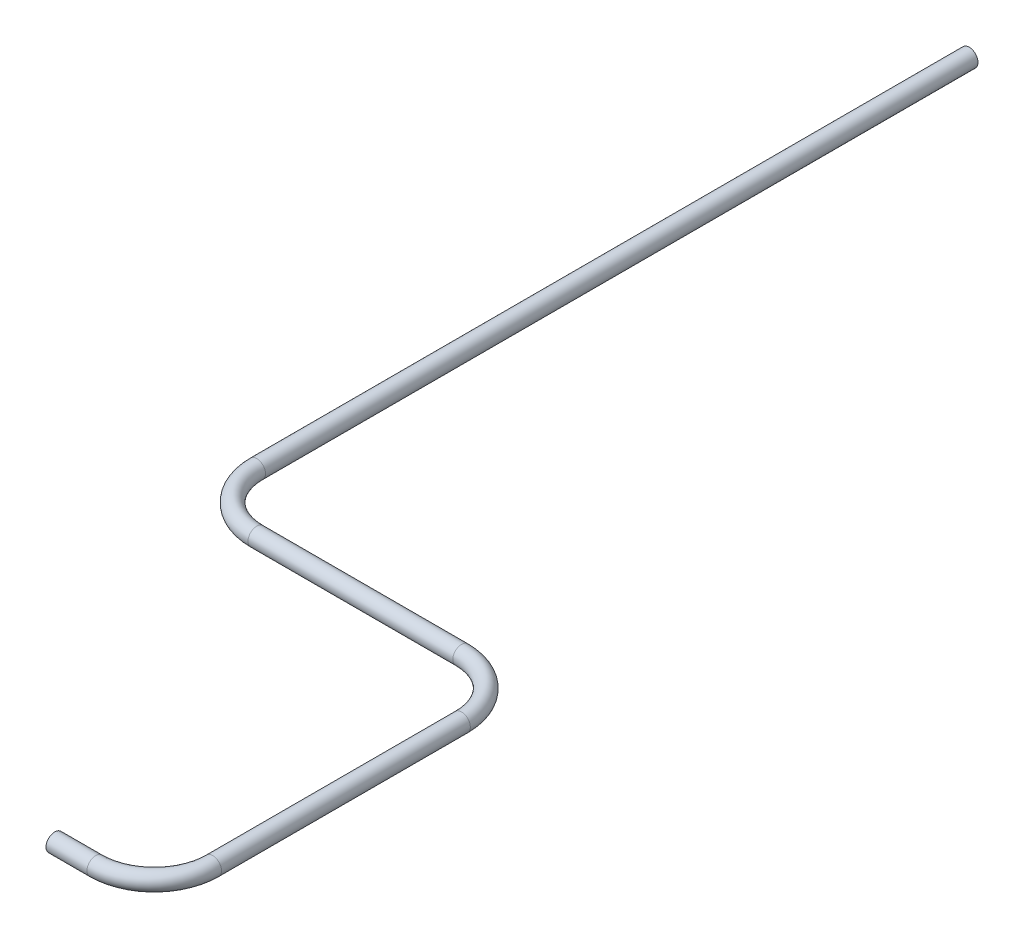
ISO-10303-21;
HEADER;
FILE_DESCRIPTION(('STEP AP214'),'2;1');
FILE_NAME('part.step','',(''),(''),'','','');
FILE_SCHEMA(('AUTOMOTIVE_DESIGN { 1 0 10303 214 1 1 1 1 }'));
ENDSEC;
DATA;
#1=APPLICATION_CONTEXT('core data for automotive mechanical design processes');
#2=APPLICATION_PROTOCOL_DEFINITION('international standard','automotive_design',2000,#1);
#3=PRODUCT_CONTEXT('',#1,'mechanical');
#4=PRODUCT('Part','Part','',(#3));
#5=PRODUCT_RELATED_PRODUCT_CATEGORY('part','',(#4));
#6=PRODUCT_DEFINITION_FORMATION('','',#4);
#7=PRODUCT_DEFINITION_CONTEXT('part definition',#1,'design');
#8=PRODUCT_DEFINITION('design','',#6,#7);
#9=PRODUCT_DEFINITION_SHAPE('','',#8);
#10=(LENGTH_UNIT() NAMED_UNIT(*) SI_UNIT(.MILLI.,.METRE.));
#11=(NAMED_UNIT(*) PLANE_ANGLE_UNIT() SI_UNIT($,.RADIAN.));
#12=(NAMED_UNIT(*) SI_UNIT($,.STERADIAN.) SOLID_ANGLE_UNIT());
#13=UNCERTAINTY_MEASURE_WITH_UNIT(LENGTH_MEASURE(1.E-05),#10,'distance_accuracy_value','');
#14=(GEOMETRIC_REPRESENTATION_CONTEXT(3) GLOBAL_UNCERTAINTY_ASSIGNED_CONTEXT((#13)) GLOBAL_UNIT_ASSIGNED_CONTEXT((#10,
#11,#12)) REPRESENTATION_CONTEXT('',''));
#15=CARTESIAN_POINT('',(0.,0.,0.));
#16=DIRECTION('',(0.,0.,1.));
#17=DIRECTION('',(1.,0.,0.));
#18=AXIS2_PLACEMENT_3D('',#15,#16,#17);
#19=CARTESIAN_POINT('',(0.,0.,0.));
#20=DIRECTION('',(0.,0.,-1.));
#21=DIRECTION('',(-1.,0.,0.));
#22=AXIS2_PLACEMENT_3D('',#19,#20,#21);
#23=PLANE('',#22);
#24=CARTESIAN_POINT('',(0.,0.,0.));
#25=DIRECTION('',(0.,0.,-1.));
#26=DIRECTION('',(-1.,0.,0.));
#27=AXIS2_PLACEMENT_3D('',#24,#25,#26);
#28=CIRCLE('',#27,1.5);
#29=CARTESIAN_POINT('',(-1.5,0.,0.));
#30=VERTEX_POINT('',#29);
#31=EDGE_CURVE('E79',#30,#30,#28,.T.);
#32=ORIENTED_EDGE('',*,*,#31,.T.);
#33=EDGE_LOOP('',(#32));
#34=FACE_BOUND('',#33,.T.);
#35=ADVANCED_FACE('F51',(#34),#23,.T.);
#36=CARTESIAN_POINT('',(38.,0.,194.29));
#37=DIRECTION('',(1.,0.,0.));
#38=DIRECTION('',(0.,0.,-1.));
#39=AXIS2_PLACEMENT_3D('',#36,#37,#38);
#40=PLANE('',#39);
#41=CARTESIAN_POINT('',(38.,0.,194.29));
#42=DIRECTION('',(1.,0.,0.));
#43=DIRECTION('',(0.,0.,-1.));
#44=AXIS2_PLACEMENT_3D('',#41,#42,#43);
#45=CIRCLE('',#44,1.5);
#46=CARTESIAN_POINT('',(38.,0.,192.79));
#47=VERTEX_POINT('',#46);
#48=EDGE_CURVE('E11',#47,#47,#45,.T.);
#49=ORIENTED_EDGE('',*,*,#48,.F.);
#50=EDGE_LOOP('',(#49));
#51=FACE_BOUND('',#50,.T.);
#52=ADVANCED_FACE('F87',(#51),#40,.F.);
#53=CARTESIAN_POINT('',(0.,0.,0.));
#54=DIRECTION('',(0.,0.,1.));
#55=DIRECTION('',(1.,0.,0.));
#56=AXIS2_PLACEMENT_3D('',#53,#54,#55);
#57=CYLINDRICAL_SURFACE('',#56,1.5);
#58=CARTESIAN_POINT('',(0.,0.,121.77));
#59=DIRECTION('',(0.,0.,-1.));
#60=DIRECTION('',(-1.,0.,0.));
#61=AXIS2_PLACEMENT_3D('',#58,#59,#60);
#62=CIRCLE('',#61,1.5);
#63=CARTESIAN_POINT('',(-1.5,0.,121.77));
#64=VERTEX_POINT('',#63);
#65=EDGE_CURVE('E76',#64,#64,#62,.T.);
#66=ORIENTED_EDGE('',*,*,#65,.T.);
#67=EDGE_LOOP('',(#66));
#68=FACE_BOUND('',#67,.T.);
#69=ORIENTED_EDGE('',*,*,#31,.F.);
#70=EDGE_LOOP('',(#69));
#71=FACE_BOUND('',#70,.T.);
#72=ADVANCED_FACE('F84',(#68,#71),#57,.T.);
#73=CARTESIAN_POINT('',(10.,0.,121.77));
#74=DIRECTION('',(0.,1.,0.));
#75=DIRECTION('',(0.,0.,1.));
#76=AXIS2_PLACEMENT_3D('',#73,#74,#75);
#77=TOROIDAL_SURFACE('',#76,10.,1.5);
#78=CARTESIAN_POINT('',(10.,0.,131.77));
#79=DIRECTION('',(-1.,0.,0.));
#80=DIRECTION('',(0.,0.,1.));
#81=AXIS2_PLACEMENT_3D('',#78,#79,#80);
#82=CIRCLE('',#81,1.5);
#83=CARTESIAN_POINT('',(10.,0.,133.27));
#84=VERTEX_POINT('',#83);
#85=EDGE_CURVE('E73',#84,#84,#82,.T.);
#86=CARTESIAN_POINT('',(10.,0.,121.77));
#87=DIRECTION('',(0.,1.,0.));
#88=DIRECTION('',(0.,0.,1.));
#89=AXIS2_PLACEMENT_3D('',#86,#87,#88);
#90=CIRCLE('',#89,11.5);
#91=EDGE_CURVE('',#64,#84,#90,.T.);
#92=ORIENTED_EDGE('',*,*,#65,.F.);
#93=ORIENTED_EDGE('',*,*,#85,.T.);
#94=ORIENTED_EDGE('',*,*,#91,.T.);
#95=ORIENTED_EDGE('',*,*,#91,.F.);
#96=EDGE_LOOP('',(#92,#94,#93,#95));
#97=FACE_BOUND('',#96,.T.);
#98=ADVANCED_FACE('F86',(#97),#77,.T.);
#99=CARTESIAN_POINT('',(10.,0.,131.77));
#100=DIRECTION('',(1.,0.,0.));
#101=DIRECTION('',(0.,0.,-1.));
#102=AXIS2_PLACEMENT_3D('',#99,#100,#101);
#103=CYLINDRICAL_SURFACE('',#102,1.5);
#104=CARTESIAN_POINT('',(45.,0.,131.77));
#105=DIRECTION('',(-1.,0.,0.));
#106=DIRECTION('',(0.,0.,1.));
#107=AXIS2_PLACEMENT_3D('',#104,#105,#106);
#108=CIRCLE('',#107,1.5);
#109=CARTESIAN_POINT('',(44.9999999999999,0.,130.27));
#110=VERTEX_POINT('',#109);
#111=EDGE_CURVE('E70',#110,#110,#108,.T.);
#112=ORIENTED_EDGE('',*,*,#111,.T.);
#113=EDGE_LOOP('',(#112));
#114=FACE_BOUND('',#113,.T.);
#115=ORIENTED_EDGE('',*,*,#85,.F.);
#116=EDGE_LOOP('',(#115));
#117=FACE_BOUND('',#116,.T.);
#118=ADVANCED_FACE('F94',(#114,#117),#103,.T.);
#119=CARTESIAN_POINT('',(45.,0.,141.77));
#120=DIRECTION('',(0.,-1.,0.));
#121=DIRECTION('',(0.,0.,-1.));
#122=AXIS2_PLACEMENT_3D('',#119,#120,#121);
#123=TOROIDAL_SURFACE('',#122,9.99999999999998,1.5);
#124=CARTESIAN_POINT('',(55.,0.,141.77));
#125=DIRECTION('',(0.,0.,-1.));
#126=DIRECTION('',(-1.,0.,0.));
#127=AXIS2_PLACEMENT_3D('',#124,#125,#126);
#128=CIRCLE('',#127,1.5);
#129=CARTESIAN_POINT('',(56.5,0.,141.77));
#130=VERTEX_POINT('',#129);
#131=EDGE_CURVE('E65',#130,#130,#128,.T.);
#132=CARTESIAN_POINT('',(45.,0.,141.77));
#133=DIRECTION('',(0.,-1.,0.));
#134=DIRECTION('',(0.,0.,-1.));
#135=AXIS2_PLACEMENT_3D('',#132,#133,#134);
#136=CIRCLE('',#135,11.5);
#137=EDGE_CURVE('',#110,#130,#136,.T.);
#138=ORIENTED_EDGE('',*,*,#111,.F.);
#139=ORIENTED_EDGE('',*,*,#131,.T.);
#140=ORIENTED_EDGE('',*,*,#137,.T.);
#141=ORIENTED_EDGE('',*,*,#137,.F.);
#142=EDGE_LOOP('',(#138,#140,#139,#141));
#143=FACE_BOUND('',#142,.T.);
#144=ADVANCED_FACE('F111',(#143),#123,.T.);
#145=CARTESIAN_POINT('',(55.,0.,141.77));
#146=DIRECTION('',(0.,0.,1.));
#147=DIRECTION('',(1.,0.,0.));
#148=AXIS2_PLACEMENT_3D('',#145,#146,#147);
#149=CYLINDRICAL_SURFACE('',#148,1.5);
#150=CARTESIAN_POINT('',(55.,0.,184.29));
#151=DIRECTION('',(0.,0.,-1.));
#152=DIRECTION('',(-1.,0.,0.));
#153=AXIS2_PLACEMENT_3D('',#150,#151,#152);
#154=CIRCLE('',#153,1.5);
#155=CARTESIAN_POINT('',(56.5,0.,184.29));
#156=VERTEX_POINT('',#155);
#157=EDGE_CURVE('E61',#156,#156,#154,.T.);
#158=ORIENTED_EDGE('',*,*,#157,.T.);
#159=EDGE_LOOP('',(#158));
#160=FACE_BOUND('',#159,.T.);
#161=ORIENTED_EDGE('',*,*,#131,.F.);
#162=EDGE_LOOP('',(#161));
#163=FACE_BOUND('',#162,.T.);
#164=ADVANCED_FACE('F105',(#160,#163),#149,.T.);
#165=CARTESIAN_POINT('',(45.,0.,184.29));
#166=DIRECTION('',(0.,-1.,0.));
#167=DIRECTION('',(0.,0.,-1.));
#168=AXIS2_PLACEMENT_3D('',#165,#166,#167);
#169=TOROIDAL_SURFACE('',#168,10.,1.5);
#170=CARTESIAN_POINT('',(45.0000000000012,0.,194.29));
#171=DIRECTION('',(1.,0.,0.));
#172=DIRECTION('',(0.,0.,-1.));
#173=AXIS2_PLACEMENT_3D('',#170,#171,#172);
#174=CIRCLE('',#173,1.5);
#175=CARTESIAN_POINT('',(45.0000000000013,0.,195.79));
#176=VERTEX_POINT('',#175);
#177=EDGE_CURVE('E57',#176,#176,#174,.T.);
#178=CARTESIAN_POINT('',(45.,0.,184.29));
#179=DIRECTION('',(0.,-1.,0.));
#180=DIRECTION('',(0.,0.,-1.));
#181=AXIS2_PLACEMENT_3D('',#178,#179,#180);
#182=CIRCLE('',#181,11.5);
#183=EDGE_CURVE('',#156,#176,#182,.T.);
#184=ORIENTED_EDGE('',*,*,#157,.F.);
#185=ORIENTED_EDGE('',*,*,#177,.T.);
#186=ORIENTED_EDGE('',*,*,#183,.T.);
#187=ORIENTED_EDGE('',*,*,#183,.F.);
#188=EDGE_LOOP('',(#184,#186,#185,#187));
#189=FACE_BOUND('',#188,.T.);
#190=ADVANCED_FACE('F100',(#189),#169,.T.);
#191=CARTESIAN_POINT('',(45.,0.,194.29));
#192=DIRECTION('',(-1.,0.,0.));
#193=DIRECTION('',(0.,0.,1.));
#194=AXIS2_PLACEMENT_3D('',#191,#192,#193);
#195=CYLINDRICAL_SURFACE('',#194,1.5);
#196=ORIENTED_EDGE('',*,*,#48,.T.);
#197=EDGE_LOOP('',(#196));
#198=FACE_BOUND('',#197,.T.);
#199=ORIENTED_EDGE('',*,*,#177,.F.);
#200=EDGE_LOOP('',(#199));
#201=FACE_BOUND('',#200,.T.);
#202=ADVANCED_FACE('F98',(#198,#201),#195,.T.);
#203=CLOSED_SHELL('',(#35,#52,#72,#98,#118,#144,#164,#190,#202));
#204=MANIFOLD_SOLID_BREP('B2',#203);
#205=ADVANCED_BREP_SHAPE_REPRESENTATION('',(#18,#204),#14);
#206=SHAPE_DEFINITION_REPRESENTATION(#9,#205);
ENDSEC;
END-ISO-10303-21;
